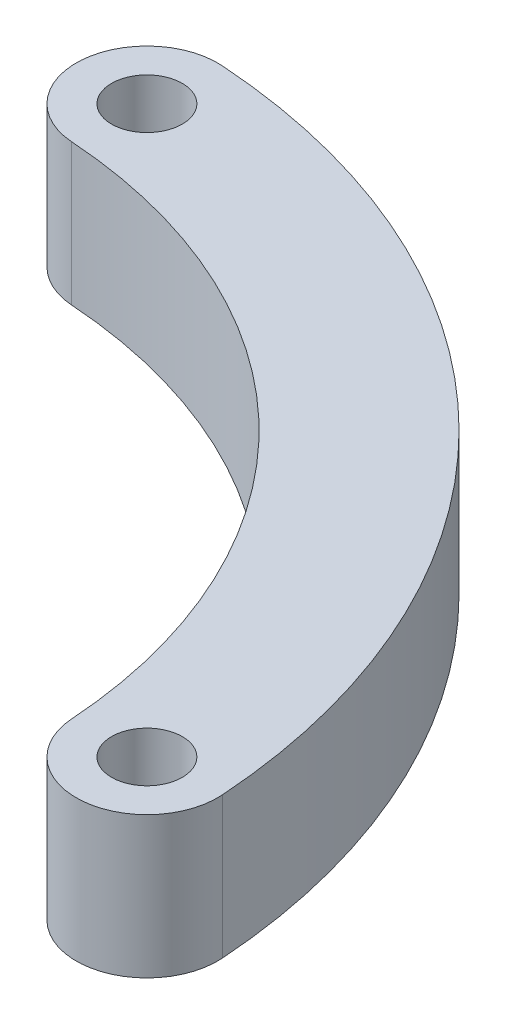
ISO-10303-21;
HEADER;
FILE_DESCRIPTION(('STEP AP214'),'2;1');
FILE_NAME('part.step','',(''),(''),'','','');
FILE_SCHEMA(('AUTOMOTIVE_DESIGN { 1 0 10303 214 1 1 1 1 }'));
ENDSEC;
DATA;
#1=APPLICATION_CONTEXT('core data for automotive mechanical design processes');
#2=APPLICATION_PROTOCOL_DEFINITION('international standard','automotive_design',2000,#1);
#3=PRODUCT_CONTEXT('',#1,'mechanical');
#4=PRODUCT('Part','Part','',(#3));
#5=PRODUCT_RELATED_PRODUCT_CATEGORY('part','',(#4));
#6=PRODUCT_DEFINITION_FORMATION('','',#4);
#7=PRODUCT_DEFINITION_CONTEXT('part definition',#1,'design');
#8=PRODUCT_DEFINITION('design','',#6,#7);
#9=PRODUCT_DEFINITION_SHAPE('','',#8);
#10=(LENGTH_UNIT() NAMED_UNIT(*) SI_UNIT(.MILLI.,.METRE.));
#11=(NAMED_UNIT(*) PLANE_ANGLE_UNIT() SI_UNIT($,.RADIAN.));
#12=(NAMED_UNIT(*) SI_UNIT($,.STERADIAN.) SOLID_ANGLE_UNIT());
#13=UNCERTAINTY_MEASURE_WITH_UNIT(LENGTH_MEASURE(1.E-05),#10,'distance_accuracy_value','');
#14=(GEOMETRIC_REPRESENTATION_CONTEXT(3) GLOBAL_UNCERTAINTY_ASSIGNED_CONTEXT((#13)) GLOBAL_UNIT_ASSIGNED_CONTEXT((#10,
#11,#12)) REPRESENTATION_CONTEXT('',''));
#15=CARTESIAN_POINT('',(0.,0.,0.));
#16=DIRECTION('',(0.,0.,1.));
#17=DIRECTION('',(1.,0.,0.));
#18=AXIS2_PLACEMENT_3D('',#15,#16,#17);
#19=CARTESIAN_POINT('',(-10.7287359684784,5.,0.728735968478447));
#20=DIRECTION('',(0.,1.,0.));
#21=DIRECTION('',(0.,0.,1.));
#22=AXIS2_PLACEMENT_3D('',#19,#20,#21);
#23=PLANE('',#22);
#24=CARTESIAN_POINT('',(-10.,5.,-10.));
#25=DIRECTION('',(0.,1.,0.));
#26=DIRECTION('',(0.,0.,1.));
#27=AXIS2_PLACEMENT_3D('',#24,#25,#26);
#28=CIRCLE('',#27,1.25);
#29=CARTESIAN_POINT('',(-10.,5.,-8.75));
#30=VERTEX_POINT('',#29);
#31=EDGE_CURVE('E100',#30,#30,#28,.T.);
#32=ORIENTED_EDGE('',*,*,#31,.F.);
#33=EDGE_LOOP('',(#32));
#34=FACE_BOUND('',#33,.T.);
#35=CARTESIAN_POINT('',(-10.,5.,-10.));
#36=DIRECTION('',(0.,1.,0.));
#37=DIRECTION('',(0.,0.,1.));
#38=AXIS2_PLACEMENT_3D('',#35,#36,#37);
#39=CIRCLE('',#38,2.5);
#40=CARTESIAN_POINT('',(-9.83058099666551,5.,-12.4942528342791));
#41=VERTEX_POINT('',#40);
#42=CARTESIAN_POINT('',(-10.1694190033345,5.,-7.50574716572094));
#43=VERTEX_POINT('',#42);
#44=EDGE_CURVE('E85',#41,#43,#39,.T.);
#45=ORIENTED_EDGE('',*,*,#44,.T.);
#46=CARTESIAN_POINT('',(-11.4574719369569,5.,11.4574719369569));
#47=DIRECTION('',(0.,-1.,0.));
#48=DIRECTION('',(0.,0.,-1.));
#49=AXIS2_PLACEMENT_3D('',#46,#47,#48);
#50=CIRCLE('',#49,19.0069134552662);
#51=CARTESIAN_POINT('',(7.50574716572094,5.,10.1694190033345));
#52=VERTEX_POINT('',#51);
#53=EDGE_CURVE('E80',#43,#52,#50,.T.);
#54=ORIENTED_EDGE('',*,*,#53,.T.);
#55=CARTESIAN_POINT('',(10.,5.,9.99999999999999));
#56=DIRECTION('',(0.,1.,0.));
#57=DIRECTION('',(0.,0.,1.));
#58=AXIS2_PLACEMENT_3D('',#55,#56,#57);
#59=CIRCLE('',#58,2.5);
#60=CARTESIAN_POINT('',(12.4942528342791,5.,9.83058099666551));
#61=VERTEX_POINT('',#60);
#62=EDGE_CURVE('E83',#52,#61,#59,.T.);
#63=ORIENTED_EDGE('',*,*,#62,.T.);
#64=CARTESIAN_POINT('',(-11.4574719369569,5.,11.4574719369569));
#65=DIRECTION('',(0.,1.,0.));
#66=DIRECTION('',(0.,0.,-1.));
#67=AXIS2_PLACEMENT_3D('',#64,#65,#66);
#68=CIRCLE('',#67,24.0069134552662);
#69=EDGE_CURVE('E50',#61,#41,#68,.T.);
#70=ORIENTED_EDGE('',*,*,#69,.T.);
#71=EDGE_LOOP('',(#45,#54,#63,#70));
#72=FACE_BOUND('',#71,.T.);
#73=CARTESIAN_POINT('',(10.,5.,10.));
#74=DIRECTION('',(0.,1.,0.));
#75=DIRECTION('',(0.,0.,1.));
#76=AXIS2_PLACEMENT_3D('',#73,#74,#75);
#77=CIRCLE('',#76,1.25);
#78=CARTESIAN_POINT('',(10.,5.,11.25));
#79=VERTEX_POINT('',#78);
#80=EDGE_CURVE('E115',#79,#79,#77,.T.);
#81=ORIENTED_EDGE('',*,*,#80,.F.);
#82=EDGE_LOOP('',(#81));
#83=FACE_BOUND('',#82,.T.);
#84=ADVANCED_FACE('F33',(#34,#72,#83),#23,.T.);
#85=CARTESIAN_POINT('',(-10.7287359684784,0.,0.728735968478447));
#86=DIRECTION('',(0.,1.,0.));
#87=DIRECTION('',(0.,0.,1.));
#88=AXIS2_PLACEMENT_3D('',#85,#86,#87);
#89=PLANE('',#88);
#90=CARTESIAN_POINT('',(-10.,0.,-10.));
#91=DIRECTION('',(0.,1.,0.));
#92=DIRECTION('',(0.,0.,1.));
#93=AXIS2_PLACEMENT_3D('',#90,#91,#92);
#94=CIRCLE('',#93,2.5);
#95=CARTESIAN_POINT('',(-9.83058099666551,0.,-12.4942528342791));
#96=VERTEX_POINT('',#95);
#97=CARTESIAN_POINT('',(-10.1694190033345,0.,-7.50574716572094));
#98=VERTEX_POINT('',#97);
#99=EDGE_CURVE('E97',#96,#98,#94,.T.);
#100=ORIENTED_EDGE('',*,*,#99,.F.);
#101=CARTESIAN_POINT('',(-11.4574719369569,0.,11.4574719369569));
#102=DIRECTION('',(0.,1.,0.));
#103=DIRECTION('',(0.,0.,-1.));
#104=AXIS2_PLACEMENT_3D('',#101,#102,#103);
#105=CIRCLE('',#104,24.0069134552662);
#106=CARTESIAN_POINT('',(12.4942528342791,0.,9.83058099666551));
#107=VERTEX_POINT('',#106);
#108=EDGE_CURVE('E73',#107,#96,#105,.T.);
#109=ORIENTED_EDGE('',*,*,#108,.F.);
#110=CARTESIAN_POINT('',(10.,0.,9.99999999999999));
#111=DIRECTION('',(0.,1.,0.));
#112=DIRECTION('',(0.,0.,1.));
#113=AXIS2_PLACEMENT_3D('',#110,#111,#112);
#114=CIRCLE('',#113,2.5);
#115=CARTESIAN_POINT('',(7.50574716572094,0.,10.1694190033345));
#116=VERTEX_POINT('',#115);
#117=EDGE_CURVE('E67',#116,#107,#114,.T.);
#118=ORIENTED_EDGE('',*,*,#117,.F.);
#119=CARTESIAN_POINT('',(-11.4574719369569,0.,11.4574719369569));
#120=DIRECTION('',(0.,-1.,0.));
#121=DIRECTION('',(0.,0.,-1.));
#122=AXIS2_PLACEMENT_3D('',#119,#120,#121);
#123=CIRCLE('',#122,19.0069134552662);
#124=EDGE_CURVE('E89',#98,#116,#123,.T.);
#125=ORIENTED_EDGE('',*,*,#124,.F.);
#126=EDGE_LOOP('',(#100,#109,#118,#125));
#127=FACE_BOUND('',#126,.T.);
#128=CARTESIAN_POINT('',(-10.,0.,-10.));
#129=DIRECTION('',(0.,1.,0.));
#130=DIRECTION('',(0.,0.,1.));
#131=AXIS2_PLACEMENT_3D('',#128,#129,#130);
#132=CIRCLE('',#131,1.25);
#133=CARTESIAN_POINT('',(-10.,0.,-8.75));
#134=VERTEX_POINT('',#133);
#135=EDGE_CURVE('E112',#134,#134,#132,.T.);
#136=ORIENTED_EDGE('',*,*,#135,.T.);
#137=EDGE_LOOP('',(#136));
#138=FACE_BOUND('',#137,.T.);
#139=CARTESIAN_POINT('',(10.,0.,10.));
#140=DIRECTION('',(0.,1.,0.));
#141=DIRECTION('',(0.,0.,1.));
#142=AXIS2_PLACEMENT_3D('',#139,#140,#141);
#143=CIRCLE('',#142,1.25);
#144=CARTESIAN_POINT('',(10.,0.,11.25));
#145=VERTEX_POINT('',#144);
#146=EDGE_CURVE('E118',#145,#145,#143,.T.);
#147=ORIENTED_EDGE('',*,*,#146,.T.);
#148=EDGE_LOOP('',(#147));
#149=FACE_BOUND('',#148,.T.);
#150=ADVANCED_FACE('F108',(#127,#138,#149),#89,.F.);
#151=CARTESIAN_POINT('',(-10.,5.,-10.));
#152=DIRECTION('',(0.,-1.,0.));
#153=DIRECTION('',(0.,0.,-1.));
#154=AXIS2_PLACEMENT_3D('',#151,#152,#153);
#155=CYLINDRICAL_SURFACE('',#154,2.5);
#156=ORIENTED_EDGE('',*,*,#99,.T.);
#157=DIRECTION('',(0.,-1.,0.));
#158=VECTOR('',#157,1.);
#159=CARTESIAN_POINT('',(-10.1694190033345,5.,-7.50574716572094));
#160=LINE('',#159,#158);
#161=EDGE_CURVE('E11',#43,#98,#160,.T.);
#162=ORIENTED_EDGE('',*,*,#161,.F.);
#163=ORIENTED_EDGE('',*,*,#44,.F.);
#164=DIRECTION('',(0.,-1.,0.));
#165=VECTOR('',#164,1.);
#166=CARTESIAN_POINT('',(-9.83058099666551,5.,-12.4942528342791));
#167=LINE('',#166,#165);
#168=EDGE_CURVE('E93',#41,#96,#167,.T.);
#169=ORIENTED_EDGE('',*,*,#168,.T.);
#170=EDGE_LOOP('',(#156,#162,#163,#169));
#171=FACE_BOUND('',#170,.T.);
#172=ADVANCED_FACE('F35',(#171),#155,.T.);
#173=CARTESIAN_POINT('',(-11.4574719369569,5.,11.4574719369569));
#174=DIRECTION('',(0.,-1.,0.));
#175=DIRECTION('',(0.,0.,-1.));
#176=AXIS2_PLACEMENT_3D('',#173,#174,#175);
#177=CYLINDRICAL_SURFACE('',#176,19.0069134552662);
#178=ORIENTED_EDGE('',*,*,#124,.T.);
#179=DIRECTION('',(0.,-1.,0.));
#180=VECTOR('',#179,1.);
#181=CARTESIAN_POINT('',(7.50574716572094,5.,10.1694190033345));
#182=LINE('',#181,#180);
#183=EDGE_CURVE('E42',#52,#116,#182,.T.);
#184=ORIENTED_EDGE('',*,*,#183,.F.);
#185=ORIENTED_EDGE('',*,*,#53,.F.);
#186=ORIENTED_EDGE('',*,*,#161,.T.);
#187=EDGE_LOOP('',(#178,#184,#185,#186));
#188=FACE_BOUND('',#187,.T.);
#189=ADVANCED_FACE('F88',(#188),#177,.F.);
#190=CARTESIAN_POINT('',(10.,5.,9.99999999999999));
#191=DIRECTION('',(0.,-1.,0.));
#192=DIRECTION('',(0.,0.,-1.));
#193=AXIS2_PLACEMENT_3D('',#190,#191,#192);
#194=CYLINDRICAL_SURFACE('',#193,2.5);
#195=ORIENTED_EDGE('',*,*,#117,.T.);
#196=DIRECTION('',(0.,-1.,0.));
#197=VECTOR('',#196,1.);
#198=CARTESIAN_POINT('',(12.4942528342791,5.,9.83058099666551));
#199=LINE('',#198,#197);
#200=EDGE_CURVE('E90',#61,#107,#199,.T.);
#201=ORIENTED_EDGE('',*,*,#200,.F.);
#202=ORIENTED_EDGE('',*,*,#62,.F.);
#203=ORIENTED_EDGE('',*,*,#183,.T.);
#204=EDGE_LOOP('',(#195,#201,#202,#203));
#205=FACE_BOUND('',#204,.T.);
#206=ADVANCED_FACE('F91',(#205),#194,.T.);
#207=CARTESIAN_POINT('',(-11.4574719369569,5.,11.4574719369569));
#208=DIRECTION('',(0.,-1.,0.));
#209=DIRECTION('',(0.,0.,-1.));
#210=AXIS2_PLACEMENT_3D('',#207,#208,#209);
#211=CYLINDRICAL_SURFACE('',#210,24.0069134552662);
#212=ORIENTED_EDGE('',*,*,#108,.T.);
#213=ORIENTED_EDGE('',*,*,#168,.F.);
#214=ORIENTED_EDGE('',*,*,#69,.F.);
#215=ORIENTED_EDGE('',*,*,#200,.T.);
#216=EDGE_LOOP('',(#212,#213,#214,#215));
#217=FACE_BOUND('',#216,.T.);
#218=ADVANCED_FACE('F105',(#217),#211,.T.);
#219=CARTESIAN_POINT('',(-10.,5.,-10.));
#220=DIRECTION('',(0.,-1.,0.));
#221=DIRECTION('',(0.,0.,-1.));
#222=AXIS2_PLACEMENT_3D('',#219,#220,#221);
#223=CYLINDRICAL_SURFACE('',#222,1.25);
#224=ORIENTED_EDGE('',*,*,#31,.T.);
#225=EDGE_LOOP('',(#224));
#226=FACE_BOUND('',#225,.T.);
#227=ORIENTED_EDGE('',*,*,#135,.F.);
#228=EDGE_LOOP('',(#227));
#229=FACE_BOUND('',#228,.T.);
#230=ADVANCED_FACE('F135',(#226,#229),#223,.F.);
#231=CARTESIAN_POINT('',(10.,5.,10.));
#232=DIRECTION('',(0.,-1.,0.));
#233=DIRECTION('',(0.,0.,-1.));
#234=AXIS2_PLACEMENT_3D('',#231,#232,#233);
#235=CYLINDRICAL_SURFACE('',#234,1.25);
#236=ORIENTED_EDGE('',*,*,#80,.T.);
#237=EDGE_LOOP('',(#236));
#238=FACE_BOUND('',#237,.T.);
#239=ORIENTED_EDGE('',*,*,#146,.F.);
#240=EDGE_LOOP('',(#239));
#241=FACE_BOUND('',#240,.T.);
#242=ADVANCED_FACE('F124',(#238,#241),#235,.F.);
#243=CLOSED_SHELL('',(#84,#150,#172,#189,#206,#218,#230,#242));
#244=MANIFOLD_SOLID_BREP('B2',#243);
#245=ADVANCED_BREP_SHAPE_REPRESENTATION('',(#18,#244),#14);
#246=SHAPE_DEFINITION_REPRESENTATION(#9,#245);
ENDSEC;
END-ISO-10303-21;
